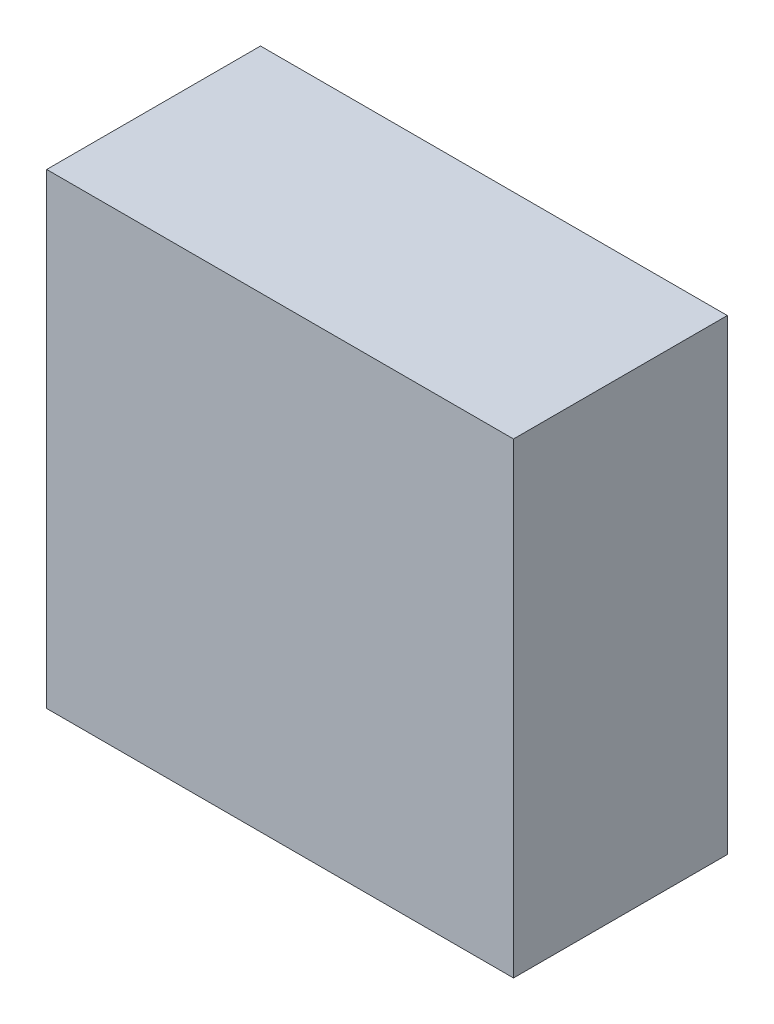
ISO-10303-21;
HEADER;
FILE_DESCRIPTION(('STEP AP214'),'2;1');
FILE_NAME('part.step','',(''),(''),'','','');
FILE_SCHEMA(('AUTOMOTIVE_DESIGN { 1 0 10303 214 1 1 1 1 }'));
ENDSEC;
DATA;
#1=APPLICATION_CONTEXT('core data for automotive mechanical design processes');
#2=APPLICATION_PROTOCOL_DEFINITION('international standard','automotive_design',2000,#1);
#3=PRODUCT_CONTEXT('',#1,'mechanical');
#4=PRODUCT('Part','Part','',(#3));
#5=PRODUCT_RELATED_PRODUCT_CATEGORY('part','',(#4));
#6=PRODUCT_DEFINITION_FORMATION('','',#4);
#7=PRODUCT_DEFINITION_CONTEXT('part definition',#1,'design');
#8=PRODUCT_DEFINITION('design','',#6,#7);
#9=PRODUCT_DEFINITION_SHAPE('','',#8);
#10=(LENGTH_UNIT() NAMED_UNIT(*) SI_UNIT(.MILLI.,.METRE.));
#11=(NAMED_UNIT(*) PLANE_ANGLE_UNIT() SI_UNIT($,.RADIAN.));
#12=(NAMED_UNIT(*) SI_UNIT($,.STERADIAN.) SOLID_ANGLE_UNIT());
#13=UNCERTAINTY_MEASURE_WITH_UNIT(LENGTH_MEASURE(1.E-05),#10,'distance_accuracy_value','');
#14=(GEOMETRIC_REPRESENTATION_CONTEXT(3) GLOBAL_UNCERTAINTY_ASSIGNED_CONTEXT((#13)) GLOBAL_UNIT_ASSIGNED_CONTEXT((#10,
#11,#12)) REPRESENTATION_CONTEXT('',''));
#15=CARTESIAN_POINT('',(0.,0.,0.));
#16=DIRECTION('',(0.,0.,1.));
#17=DIRECTION('',(1.,0.,0.));
#18=AXIS2_PLACEMENT_3D('',#15,#16,#17);
#19=CARTESIAN_POINT('',(-1.,0.,120.));
#20=DIRECTION('',(1.,0.,0.));
#21=DIRECTION('',(0.,0.,-1.));
#22=AXIS2_PLACEMENT_3D('',#19,#20,#21);
#23=PLANE('',#22);
#24=DIRECTION('',(0.,-1.,0.));
#25=VECTOR('',#24,1.);
#26=CARTESIAN_POINT('',(-1.,0.,0.));
#27=LINE('',#26,#25);
#28=CARTESIAN_POINT('',(-1.,261.,0.));
#29=VERTEX_POINT('',#28);
#30=CARTESIAN_POINT('',(-1.,-1.,0.));
#31=VERTEX_POINT('',#30);
#32=EDGE_CURVE('E132',#29,#31,#27,.T.);
#33=ORIENTED_EDGE('',*,*,#32,.T.);
#34=DIRECTION('',(0.,0.,-1.));
#35=VECTOR('',#34,1.);
#36=CARTESIAN_POINT('',(-1.,-1.,120.));
#37=LINE('',#36,#35);
#38=CARTESIAN_POINT('',(-1.,-1.,120.));
#39=VERTEX_POINT('',#38);
#40=EDGE_CURVE('E11',#39,#31,#37,.T.);
#41=ORIENTED_EDGE('',*,*,#40,.F.);
#42=DIRECTION('',(0.,-1.,0.));
#43=VECTOR('',#42,1.);
#44=CARTESIAN_POINT('',(-1.,0.,120.));
#45=LINE('',#44,#43);
#46=CARTESIAN_POINT('',(-1.,261.,120.));
#47=VERTEX_POINT('',#46);
#48=EDGE_CURVE('E142',#47,#39,#45,.T.);
#49=ORIENTED_EDGE('',*,*,#48,.F.);
#50=DIRECTION('',(0.,0.,-1.));
#51=VECTOR('',#50,1.);
#52=CARTESIAN_POINT('',(-1.,261.,120.));
#53=LINE('',#52,#51);
#54=EDGE_CURVE('E147',#47,#29,#53,.T.);
#55=ORIENTED_EDGE('',*,*,#54,.T.);
#56=EDGE_LOOP('',(#33,#41,#49,#55));
#57=FACE_BOUND('',#56,.T.);
#58=ADVANCED_FACE('F34',(#57),#23,.F.);
#59=CARTESIAN_POINT('',(0.,-1.,120.));
#60=DIRECTION('',(0.,1.,0.));
#61=DIRECTION('',(0.,0.,1.));
#62=AXIS2_PLACEMENT_3D('',#59,#60,#61);
#63=PLANE('',#62);
#64=DIRECTION('',(1.,0.,0.));
#65=VECTOR('',#64,1.);
#66=CARTESIAN_POINT('',(0.,-1.,0.));
#67=LINE('',#66,#65);
#68=CARTESIAN_POINT('',(261.,-1.,0.));
#69=VERTEX_POINT('',#68);
#70=EDGE_CURVE('E136',#31,#69,#67,.T.);
#71=ORIENTED_EDGE('',*,*,#70,.T.);
#72=DIRECTION('',(0.,0.,-1.));
#73=VECTOR('',#72,1.);
#74=CARTESIAN_POINT('',(261.,-1.,120.));
#75=LINE('',#74,#73);
#76=CARTESIAN_POINT('',(261.,-1.,120.));
#77=VERTEX_POINT('',#76);
#78=EDGE_CURVE('E42',#77,#69,#75,.T.);
#79=ORIENTED_EDGE('',*,*,#78,.F.);
#80=DIRECTION('',(1.,0.,0.));
#81=VECTOR('',#80,1.);
#82=CARTESIAN_POINT('',(0.,-1.,120.));
#83=LINE('',#82,#81);
#84=EDGE_CURVE('E81',#39,#77,#83,.T.);
#85=ORIENTED_EDGE('',*,*,#84,.F.);
#86=ORIENTED_EDGE('',*,*,#40,.T.);
#87=EDGE_LOOP('',(#71,#79,#85,#86));
#88=FACE_BOUND('',#87,.T.);
#89=ADVANCED_FACE('F171',(#88),#63,.F.);
#90=CARTESIAN_POINT('',(261.,0.,120.));
#91=DIRECTION('',(-1.,0.,0.));
#92=DIRECTION('',(0.,0.,1.));
#93=AXIS2_PLACEMENT_3D('',#90,#91,#92);
#94=PLANE('',#93);
#95=DIRECTION('',(0.,1.,0.));
#96=VECTOR('',#95,1.);
#97=CARTESIAN_POINT('',(261.,0.,0.));
#98=LINE('',#97,#96);
#99=CARTESIAN_POINT('',(261.,261.,0.));
#100=VERTEX_POINT('',#99);
#101=EDGE_CURVE('E68',#69,#100,#98,.T.);
#102=ORIENTED_EDGE('',*,*,#101,.T.);
#103=DIRECTION('',(0.,0.,-1.));
#104=VECTOR('',#103,1.);
#105=CARTESIAN_POINT('',(261.,261.,120.));
#106=LINE('',#105,#104);
#107=CARTESIAN_POINT('',(261.,261.,120.));
#108=VERTEX_POINT('',#107);
#109=EDGE_CURVE('E153',#108,#100,#106,.T.);
#110=ORIENTED_EDGE('',*,*,#109,.F.);
#111=DIRECTION('',(0.,1.,0.));
#112=VECTOR('',#111,1.);
#113=CARTESIAN_POINT('',(261.,0.,120.));
#114=LINE('',#113,#112);
#115=EDGE_CURVE('E145',#77,#108,#114,.T.);
#116=ORIENTED_EDGE('',*,*,#115,.F.);
#117=ORIENTED_EDGE('',*,*,#78,.T.);
#118=EDGE_LOOP('',(#102,#110,#116,#117));
#119=FACE_BOUND('',#118,.T.);
#120=ADVANCED_FACE('F155',(#119),#94,.F.);
#121=CARTESIAN_POINT('',(0.,261.,120.));
#122=DIRECTION('',(0.,-1.,0.));
#123=DIRECTION('',(0.,0.,-1.));
#124=AXIS2_PLACEMENT_3D('',#121,#122,#123);
#125=PLANE('',#124);
#126=DIRECTION('',(-1.,0.,0.));
#127=VECTOR('',#126,1.);
#128=CARTESIAN_POINT('',(0.,261.,0.));
#129=LINE('',#128,#127);
#130=EDGE_CURVE('E74',#100,#29,#129,.T.);
#131=ORIENTED_EDGE('',*,*,#130,.T.);
#132=ORIENTED_EDGE('',*,*,#54,.F.);
#133=DIRECTION('',(-1.,0.,0.));
#134=VECTOR('',#133,1.);
#135=CARTESIAN_POINT('',(0.,261.,120.));
#136=LINE('',#135,#134);
#137=EDGE_CURVE('E50',#108,#47,#136,.T.);
#138=ORIENTED_EDGE('',*,*,#137,.F.);
#139=ORIENTED_EDGE('',*,*,#109,.T.);
#140=EDGE_LOOP('',(#131,#132,#138,#139));
#141=FACE_BOUND('',#140,.T.);
#142=ADVANCED_FACE('F162',(#141),#125,.F.);
#143=CARTESIAN_POINT('',(0.,0.,120.));
#144=DIRECTION('',(0.,0.,1.));
#145=DIRECTION('',(1.,0.,0.));
#146=AXIS2_PLACEMENT_3D('',#143,#144,#145);
#147=PLANE('',#146);
#148=ORIENTED_EDGE('',*,*,#48,.T.);
#149=ORIENTED_EDGE('',*,*,#84,.T.);
#150=ORIENTED_EDGE('',*,*,#115,.T.);
#151=ORIENTED_EDGE('',*,*,#137,.T.);
#152=EDGE_LOOP('',(#148,#149,#150,#151));
#153=FACE_BOUND('',#152,.T.);
#154=ADVANCED_FACE('F164',(#153),#147,.T.);
#155=CARTESIAN_POINT('',(0.,0.,0.));
#156=DIRECTION('',(0.,0.,1.));
#157=DIRECTION('',(1.,0.,0.));
#158=AXIS2_PLACEMENT_3D('',#155,#156,#157);
#159=PLANE('',#158);
#160=ORIENTED_EDGE('',*,*,#32,.F.);
#161=ORIENTED_EDGE('',*,*,#130,.F.);
#162=ORIENTED_EDGE('',*,*,#101,.F.);
#163=ORIENTED_EDGE('',*,*,#70,.F.);
#164=EDGE_LOOP('',(#160,#161,#162,#163));
#165=FACE_BOUND('',#164,.T.);
#166=ADVANCED_FACE('F158',(#165),#159,.F.);
#167=CLOSED_SHELL('',(#58,#89,#120,#142,#154,#166));
#168=CARTESIAN_POINT('',(0.,0.,119.));
#169=DIRECTION('',(1.,0.,0.));
#170=DIRECTION('',(0.,0.,-1.));
#171=AXIS2_PLACEMENT_3D('',#168,#169,#170);
#172=PLANE('',#171);
#173=DIRECTION('',(0.,-1.,0.));
#174=VECTOR('',#173,1.);
#175=CARTESIAN_POINT('',(0.,0.,1.));
#176=LINE('',#175,#174);
#177=CARTESIAN_POINT('',(0.,260.,1.));
#178=VERTEX_POINT('',#177);
#179=CARTESIAN_POINT('',(0.,0.,1.));
#180=VERTEX_POINT('',#179);
#181=EDGE_CURVE('E261',#178,#180,#176,.T.);
#182=ORIENTED_EDGE('',*,*,#181,.F.);
#183=DIRECTION('',(0.,0.,-1.));
#184=VECTOR('',#183,1.);
#185=CARTESIAN_POINT('',(0.,260.,119.));
#186=LINE('',#185,#184);
#187=CARTESIAN_POINT('',(0.,260.,119.));
#188=VERTEX_POINT('',#187);
#189=EDGE_CURVE('E127',#188,#178,#186,.T.);
#190=ORIENTED_EDGE('',*,*,#189,.F.);
#191=DIRECTION('',(0.,-1.,0.));
#192=VECTOR('',#191,1.);
#193=CARTESIAN_POINT('',(0.,0.,119.));
#194=LINE('',#193,#192);
#195=CARTESIAN_POINT('',(0.,0.,119.));
#196=VERTEX_POINT('',#195);
#197=EDGE_CURVE('E112',#188,#196,#194,.T.);
#198=ORIENTED_EDGE('',*,*,#197,.T.);
#199=DIRECTION('',(0.,0.,-1.));
#200=VECTOR('',#199,1.);
#201=CARTESIAN_POINT('',(0.,0.,119.));
#202=LINE('',#201,#200);
#203=EDGE_CURVE('E124',#196,#180,#202,.T.);
#204=ORIENTED_EDGE('',*,*,#203,.T.);
#205=EDGE_LOOP('',(#182,#190,#198,#204));
#206=FACE_BOUND('',#205,.T.);
#207=ADVANCED_FACE('F123',(#206),#172,.T.);
#208=CARTESIAN_POINT('',(0.,0.,119.));
#209=DIRECTION('',(0.,1.,0.));
#210=DIRECTION('',(0.,0.,1.));
#211=AXIS2_PLACEMENT_3D('',#208,#209,#210);
#212=PLANE('',#211);
#213=DIRECTION('',(1.,0.,0.));
#214=VECTOR('',#213,1.);
#215=CARTESIAN_POINT('',(0.,0.,1.));
#216=LINE('',#215,#214);
#217=CARTESIAN_POINT('',(260.,0.,1.));
#218=VERTEX_POINT('',#217);
#219=EDGE_CURVE('E131',#180,#218,#216,.T.);
#220=ORIENTED_EDGE('',*,*,#219,.F.);
#221=ORIENTED_EDGE('',*,*,#203,.F.);
#222=DIRECTION('',(1.,0.,0.));
#223=VECTOR('',#222,1.);
#224=CARTESIAN_POINT('',(0.,0.,119.));
#225=LINE('',#224,#223);
#226=CARTESIAN_POINT('',(260.,0.,119.));
#227=VERTEX_POINT('',#226);
#228=EDGE_CURVE('E108',#196,#227,#225,.T.);
#229=ORIENTED_EDGE('',*,*,#228,.T.);
#230=DIRECTION('',(0.,0.,-1.));
#231=VECTOR('',#230,1.);
#232=CARTESIAN_POINT('',(260.,0.,119.));
#233=LINE('',#232,#231);
#234=EDGE_CURVE('E133',#227,#218,#233,.T.);
#235=ORIENTED_EDGE('',*,*,#234,.T.);
#236=EDGE_LOOP('',(#220,#221,#229,#235));
#237=FACE_BOUND('',#236,.T.);
#238=ADVANCED_FACE('F130',(#237),#212,.T.);
#239=CARTESIAN_POINT('',(260.,0.,119.));
#240=DIRECTION('',(-1.,0.,0.));
#241=DIRECTION('',(0.,0.,1.));
#242=AXIS2_PLACEMENT_3D('',#239,#240,#241);
#243=PLANE('',#242);
#244=DIRECTION('',(0.,1.,0.));
#245=VECTOR('',#244,1.);
#246=CARTESIAN_POINT('',(260.,0.,1.));
#247=LINE('',#246,#245);
#248=CARTESIAN_POINT('',(260.,260.,1.));
#249=VERTEX_POINT('',#248);
#250=EDGE_CURVE('E264',#218,#249,#247,.T.);
#251=ORIENTED_EDGE('',*,*,#250,.F.);
#252=ORIENTED_EDGE('',*,*,#234,.F.);
#253=DIRECTION('',(0.,1.,0.));
#254=VECTOR('',#253,1.);
#255=CARTESIAN_POINT('',(260.,0.,119.));
#256=LINE('',#255,#254);
#257=CARTESIAN_POINT('',(260.,260.,119.));
#258=VERTEX_POINT('',#257);
#259=EDGE_CURVE('E113',#227,#258,#256,.T.);
#260=ORIENTED_EDGE('',*,*,#259,.T.);
#261=DIRECTION('',(0.,0.,-1.));
#262=VECTOR('',#261,1.);
#263=CARTESIAN_POINT('',(260.,260.,119.));
#264=LINE('',#263,#262);
#265=EDGE_CURVE('E138',#258,#249,#264,.T.);
#266=ORIENTED_EDGE('',*,*,#265,.T.);
#267=EDGE_LOOP('',(#251,#252,#260,#266));
#268=FACE_BOUND('',#267,.T.);
#269=ADVANCED_FACE('F219',(#268),#243,.T.);
#270=CARTESIAN_POINT('',(0.,260.,119.));
#271=DIRECTION('',(0.,-1.,0.));
#272=DIRECTION('',(0.,0.,-1.));
#273=AXIS2_PLACEMENT_3D('',#270,#271,#272);
#274=PLANE('',#273);
#275=DIRECTION('',(-1.,0.,0.));
#276=VECTOR('',#275,1.);
#277=CARTESIAN_POINT('',(0.,260.,1.));
#278=LINE('',#277,#276);
#279=EDGE_CURVE('E128',#249,#178,#278,.T.);
#280=ORIENTED_EDGE('',*,*,#279,.F.);
#281=ORIENTED_EDGE('',*,*,#265,.F.);
#282=DIRECTION('',(-1.,0.,0.));
#283=VECTOR('',#282,1.);
#284=CARTESIAN_POINT('',(0.,260.,119.));
#285=LINE('',#284,#283);
#286=EDGE_CURVE('E267',#258,#188,#285,.T.);
#287=ORIENTED_EDGE('',*,*,#286,.T.);
#288=ORIENTED_EDGE('',*,*,#189,.T.);
#289=EDGE_LOOP('',(#280,#281,#287,#288));
#290=FACE_BOUND('',#289,.T.);
#291=ADVANCED_FACE('F228',(#290),#274,.T.);
#292=CARTESIAN_POINT('',(0.,0.,119.));
#293=DIRECTION('',(0.,0.,1.));
#294=DIRECTION('',(1.,0.,0.));
#295=AXIS2_PLACEMENT_3D('',#292,#293,#294);
#296=PLANE('',#295);
#297=ORIENTED_EDGE('',*,*,#197,.F.);
#298=ORIENTED_EDGE('',*,*,#286,.F.);
#299=ORIENTED_EDGE('',*,*,#259,.F.);
#300=ORIENTED_EDGE('',*,*,#228,.F.);
#301=EDGE_LOOP('',(#297,#298,#299,#300));
#302=FACE_BOUND('',#301,.T.);
#303=ADVANCED_FACE('F110',(#302),#296,.F.);
#304=CARTESIAN_POINT('',(0.,0.,1.));
#305=DIRECTION('',(0.,0.,1.));
#306=DIRECTION('',(1.,0.,0.));
#307=AXIS2_PLACEMENT_3D('',#304,#305,#306);
#308=PLANE('',#307);
#309=ORIENTED_EDGE('',*,*,#181,.T.);
#310=ORIENTED_EDGE('',*,*,#219,.T.);
#311=ORIENTED_EDGE('',*,*,#250,.T.);
#312=ORIENTED_EDGE('',*,*,#279,.T.);
#313=EDGE_LOOP('',(#309,#310,#311,#312));
#314=FACE_BOUND('',#313,.T.);
#315=ADVANCED_FACE('F247',(#314),#308,.T.);
#316=CLOSED_SHELL('',(#207,#238,#269,#291,#303,#315));
#317=ORIENTED_CLOSED_SHELL('',*,#316,.T.);
#318=BREP_WITH_VOIDS('B2',#167,(#317));
#319=ADVANCED_BREP_SHAPE_REPRESENTATION('',(#18,#318),#14);
#320=SHAPE_DEFINITION_REPRESENTATION(#9,#319);
ENDSEC;
END-ISO-10303-21;
